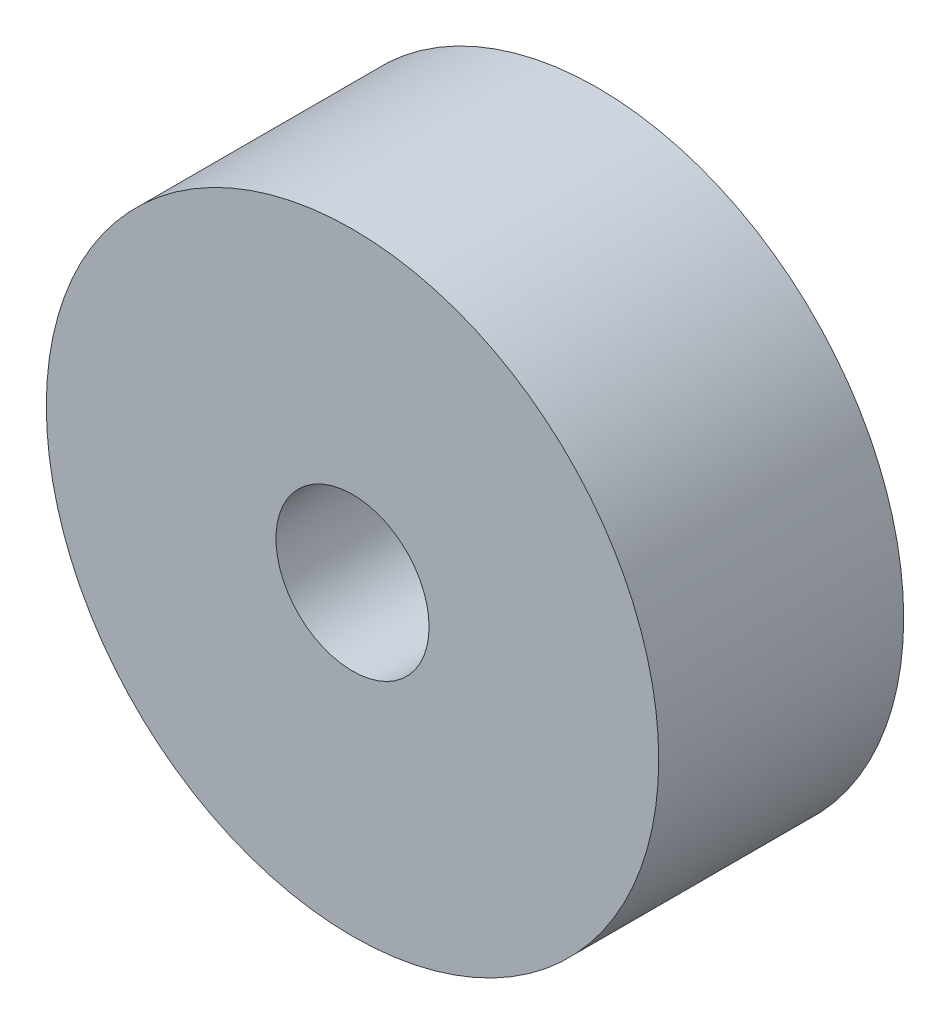
ISO-10303-21;
HEADER;
FILE_DESCRIPTION(('STEP AP214'),'2;1');
FILE_NAME('part.step','',(''),(''),'','','');
FILE_SCHEMA(('AUTOMOTIVE_DESIGN { 1 0 10303 214 1 1 1 1 }'));
ENDSEC;
DATA;
#1=APPLICATION_CONTEXT('core data for automotive mechanical design processes');
#2=APPLICATION_PROTOCOL_DEFINITION('international standard','automotive_design',2000,#1);
#3=PRODUCT_CONTEXT('',#1,'mechanical');
#4=PRODUCT('Part','Part','',(#3));
#5=PRODUCT_RELATED_PRODUCT_CATEGORY('part','',(#4));
#6=PRODUCT_DEFINITION_FORMATION('','',#4);
#7=PRODUCT_DEFINITION_CONTEXT('part definition',#1,'design');
#8=PRODUCT_DEFINITION('design','',#6,#7);
#9=PRODUCT_DEFINITION_SHAPE('','',#8);
#10=(LENGTH_UNIT() NAMED_UNIT(*) SI_UNIT(.MILLI.,.METRE.));
#11=(NAMED_UNIT(*) PLANE_ANGLE_UNIT() SI_UNIT($,.RADIAN.));
#12=(NAMED_UNIT(*) SI_UNIT($,.STERADIAN.) SOLID_ANGLE_UNIT());
#13=UNCERTAINTY_MEASURE_WITH_UNIT(LENGTH_MEASURE(1.E-05),#10,'distance_accuracy_value','');
#14=(GEOMETRIC_REPRESENTATION_CONTEXT(3) GLOBAL_UNCERTAINTY_ASSIGNED_CONTEXT((#13)) GLOBAL_UNIT_ASSIGNED_CONTEXT((#10,
#11,#12)) REPRESENTATION_CONTEXT('',''));
#15=CARTESIAN_POINT('',(0.,0.,0.));
#16=DIRECTION('',(0.,0.,1.));
#17=DIRECTION('',(1.,0.,0.));
#18=AXIS2_PLACEMENT_3D('',#15,#16,#17);
#19=CARTESIAN_POINT('',(0.,0.,8.));
#20=DIRECTION('',(0.,0.,1.));
#21=DIRECTION('',(1.,0.,0.));
#22=AXIS2_PLACEMENT_3D('',#19,#20,#21);
#23=PLANE('',#22);
#24=CARTESIAN_POINT('',(0.,0.,8.));
#25=DIRECTION('',(0.,0.,1.));
#26=DIRECTION('',(1.,0.,0.));
#27=AXIS2_PLACEMENT_3D('',#24,#25,#26);
#28=CIRCLE('',#27,10.);
#29=CARTESIAN_POINT('',(10.,0.,8.));
#30=VERTEX_POINT('',#29);
#31=EDGE_CURVE('E10',#30,#30,#28,.T.);
#32=ORIENTED_EDGE('',*,*,#31,.T.);
#33=EDGE_LOOP('',(#32));
#34=FACE_BOUND('',#33,.T.);
#35=CARTESIAN_POINT('',(0.,0.,8.));
#36=DIRECTION('',(0.,0.,1.));
#37=DIRECTION('',(1.,0.,0.));
#38=AXIS2_PLACEMENT_3D('',#35,#36,#37);
#39=CIRCLE('',#38,2.5);
#40=CARTESIAN_POINT('',(2.5,0.,8.));
#41=VERTEX_POINT('',#40);
#42=EDGE_CURVE('E48',#41,#41,#39,.T.);
#43=ORIENTED_EDGE('',*,*,#42,.F.);
#44=EDGE_LOOP('',(#43));
#45=FACE_BOUND('',#44,.T.);
#46=ADVANCED_FACE('F37',(#34,#45),#23,.T.);
#47=CARTESIAN_POINT('',(0.,0.,0.));
#48=DIRECTION('',(0.,0.,1.));
#49=DIRECTION('',(1.,0.,0.));
#50=AXIS2_PLACEMENT_3D('',#47,#48,#49);
#51=PLANE('',#50);
#52=CARTESIAN_POINT('',(0.,0.,0.));
#53=DIRECTION('',(0.,0.,1.));
#54=DIRECTION('',(1.,0.,0.));
#55=AXIS2_PLACEMENT_3D('',#52,#53,#54);
#56=CIRCLE('',#55,10.);
#57=CARTESIAN_POINT('',(10.,0.,0.));
#58=VERTEX_POINT('',#57);
#59=EDGE_CURVE('E41',#58,#58,#56,.T.);
#60=ORIENTED_EDGE('',*,*,#59,.F.);
#61=EDGE_LOOP('',(#60));
#62=FACE_BOUND('',#61,.T.);
#63=CARTESIAN_POINT('',(0.,0.,0.));
#64=DIRECTION('',(0.,0.,1.));
#65=DIRECTION('',(1.,0.,0.));
#66=AXIS2_PLACEMENT_3D('',#63,#64,#65);
#67=CIRCLE('',#66,2.5);
#68=CARTESIAN_POINT('',(2.5,0.,0.));
#69=VERTEX_POINT('',#68);
#70=EDGE_CURVE('E50',#69,#69,#67,.T.);
#71=ORIENTED_EDGE('',*,*,#70,.T.);
#72=EDGE_LOOP('',(#71));
#73=FACE_BOUND('',#72,.T.);
#74=ADVANCED_FACE('F60',(#62,#73),#51,.F.);
#75=CARTESIAN_POINT('',(0.,0.,8.));
#76=DIRECTION('',(0.,0.,-1.));
#77=DIRECTION('',(-1.,0.,0.));
#78=AXIS2_PLACEMENT_3D('',#75,#76,#77);
#79=CYLINDRICAL_SURFACE('',#78,10.);
#80=ORIENTED_EDGE('',*,*,#31,.F.);
#81=EDGE_LOOP('',(#80));
#82=FACE_BOUND('',#81,.T.);
#83=ORIENTED_EDGE('',*,*,#59,.T.);
#84=EDGE_LOOP('',(#83));
#85=FACE_BOUND('',#84,.T.);
#86=ADVANCED_FACE('F39',(#82,#85),#79,.T.);
#87=CARTESIAN_POINT('',(0.,0.,8.));
#88=DIRECTION('',(0.,0.,-1.));
#89=DIRECTION('',(-1.,0.,0.));
#90=AXIS2_PLACEMENT_3D('',#87,#88,#89);
#91=CYLINDRICAL_SURFACE('',#90,2.5);
#92=ORIENTED_EDGE('',*,*,#42,.T.);
#93=EDGE_LOOP('',(#92));
#94=FACE_BOUND('',#93,.T.);
#95=ORIENTED_EDGE('',*,*,#70,.F.);
#96=EDGE_LOOP('',(#95));
#97=FACE_BOUND('',#96,.T.);
#98=ADVANCED_FACE('F56',(#94,#97),#91,.F.);
#99=CLOSED_SHELL('',(#46,#74,#86,#98));
#100=MANIFOLD_SOLID_BREP('B2',#99);
#101=ADVANCED_BREP_SHAPE_REPRESENTATION('',(#18,#100),#14);
#102=SHAPE_DEFINITION_REPRESENTATION(#9,#101);
ENDSEC;
END-ISO-10303-21;
